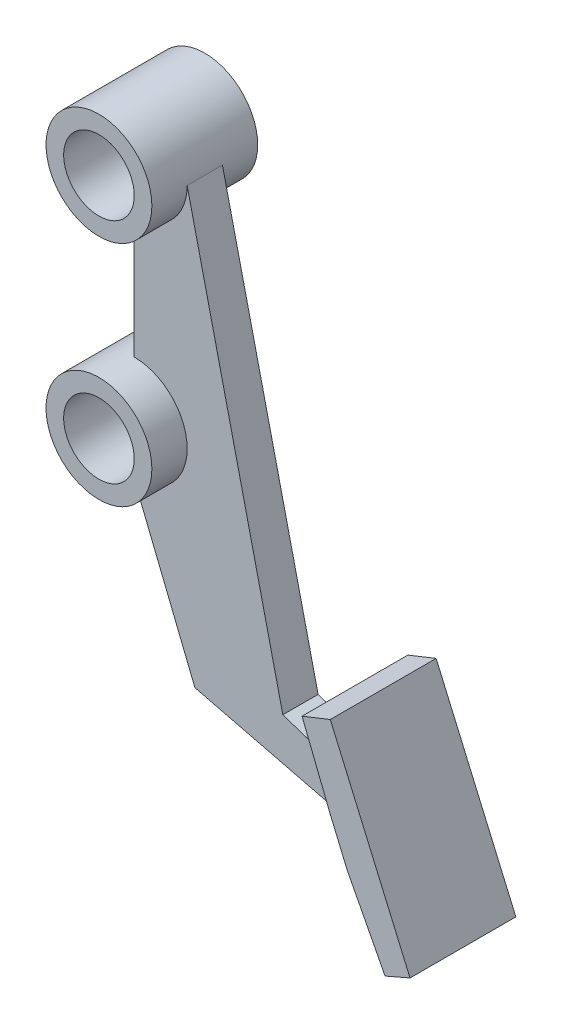
ISO-10303-21;
HEADER;
FILE_DESCRIPTION(('STEP AP214'),'2;1');
FILE_NAME('part.step','',(''),(''),'','','');
FILE_SCHEMA(('AUTOMOTIVE_DESIGN { 1 0 10303 214 1 1 1 1 }'));
ENDSEC;
DATA;
#1=APPLICATION_CONTEXT('core data for automotive mechanical design processes');
#2=APPLICATION_PROTOCOL_DEFINITION('international standard','automotive_design',2000,#1);
#3=PRODUCT_CONTEXT('',#1,'mechanical');
#4=PRODUCT('Part','Part','',(#3));
#5=PRODUCT_RELATED_PRODUCT_CATEGORY('part','',(#4));
#6=PRODUCT_DEFINITION_FORMATION('','',#4);
#7=PRODUCT_DEFINITION_CONTEXT('part definition',#1,'design');
#8=PRODUCT_DEFINITION('design','',#6,#7);
#9=PRODUCT_DEFINITION_SHAPE('','',#8);
#10=(LENGTH_UNIT() NAMED_UNIT(*) SI_UNIT(.MILLI.,.METRE.));
#11=(NAMED_UNIT(*) PLANE_ANGLE_UNIT() SI_UNIT($,.RADIAN.));
#12=(NAMED_UNIT(*) SI_UNIT($,.STERADIAN.) SOLID_ANGLE_UNIT());
#13=UNCERTAINTY_MEASURE_WITH_UNIT(LENGTH_MEASURE(1.E-05),#10,'distance_accuracy_value','');
#14=(GEOMETRIC_REPRESENTATION_CONTEXT(3) GLOBAL_UNCERTAINTY_ASSIGNED_CONTEXT((#13)) GLOBAL_UNIT_ASSIGNED_CONTEXT((#10,
#11,#12)) REPRESENTATION_CONTEXT('',''));
#15=CARTESIAN_POINT('',(0.,0.,0.));
#16=DIRECTION('',(0.,0.,1.));
#17=DIRECTION('',(1.,0.,0.));
#18=AXIS2_PLACEMENT_3D('',#15,#16,#17);
#19=CARTESIAN_POINT('',(0.,0.,5.));
#20=DIRECTION('',(-1.,0.,0.));
#21=DIRECTION('',(0.,0.,1.));
#22=AXIS2_PLACEMENT_3D('',#19,#20,#21);
#23=PLANE('',#22);
#24=DIRECTION('',(0.,1.,0.));
#25=VECTOR('',#24,1.);
#26=CARTESIAN_POINT('',(0.,0.,-5.));
#27=LINE('',#26,#25);
#28=CARTESIAN_POINT('',(0.,15.,-5.));
#29=VERTEX_POINT('',#28);
#30=CARTESIAN_POINT('',(0.,49.6107421590963,-5.));
#31=VERTEX_POINT('',#30);
#32=EDGE_CURVE('E103',#29,#31,#27,.T.);
#33=ORIENTED_EDGE('',*,*,#32,.F.);
#34=DIRECTION('',(0.,0.,-1.));
#35=VECTOR('',#34,1.);
#36=CARTESIAN_POINT('',(0.,15.,5.));
#37=LINE('',#36,#35);
#38=CARTESIAN_POINT('',(0.,15.,5.));
#39=VERTEX_POINT('',#38);
#40=EDGE_CURVE('E50',#39,#29,#37,.T.);
#41=ORIENTED_EDGE('',*,*,#40,.F.);
#42=DIRECTION('',(0.,1.,0.));
#43=VECTOR('',#42,1.);
#44=CARTESIAN_POINT('',(0.,0.,5.));
#45=LINE('',#44,#43);
#46=CARTESIAN_POINT('',(0.,49.6107421590963,5.));
#47=VERTEX_POINT('',#46);
#48=EDGE_CURVE('E109',#39,#47,#45,.T.);
#49=ORIENTED_EDGE('',*,*,#48,.T.);
#50=DIRECTION('',(0.,0.,-1.));
#51=VECTOR('',#50,1.);
#52=CARTESIAN_POINT('',(0.,49.6107421590963,5.));
#53=LINE('',#52,#51);
#54=EDGE_CURVE('E12',#47,#31,#53,.T.);
#55=ORIENTED_EDGE('',*,*,#54,.T.);
#56=EDGE_LOOP('',(#33,#41,#49,#55));
#57=FACE_BOUND('',#56,.T.);
#58=ADVANCED_FACE('F42',(#57),#23,.T.);
#59=CARTESIAN_POINT('',(-5.21039874873487,-2.1053966893587,5.));
#60=DIRECTION('',(-0.927167849264318,-0.374646205493369,0.));
#61=DIRECTION('',(0.374646205493369,-0.927167849264318,0.));
#62=AXIS2_PLACEMENT_3D('',#59,#60,#61);
#63=PLANE('',#62);
#64=DIRECTION('',(-0.374646205493369,0.927167849264318,0.));
#65=VECTOR('',#64,1.);
#66=CARTESIAN_POINT('',(-5.21039874873487,-2.1053966893587,-5.));
#67=LINE('',#66,#65);
#68=CARTESIAN_POINT('',(17.2014048465913,-57.5697345978355,-5.));
#69=VERTEX_POINT('',#68);
#70=CARTESIAN_POINT('',(0.,-15.,-5.));
#71=VERTEX_POINT('',#70);
#72=EDGE_CURVE('E143',#69,#71,#67,.T.);
#73=ORIENTED_EDGE('',*,*,#72,.F.);
#74=DIRECTION('',(0.,0.,-1.));
#75=VECTOR('',#74,1.);
#76=CARTESIAN_POINT('',(17.2014048465913,-57.5697345978355,5.));
#77=LINE('',#76,#75);
#78=CARTESIAN_POINT('',(17.2014048465913,-57.5697345978355,5.));
#79=VERTEX_POINT('',#78);
#80=EDGE_CURVE('E121',#79,#69,#77,.T.);
#81=ORIENTED_EDGE('',*,*,#80,.F.);
#82=DIRECTION('',(-0.374646205493369,0.927167849264318,0.));
#83=VECTOR('',#82,1.);
#84=CARTESIAN_POINT('',(-5.21039874873487,-2.1053966893587,5.));
#85=LINE('',#84,#83);
#86=CARTESIAN_POINT('',(0.,-15.,5.));
#87=VERTEX_POINT('',#86);
#88=EDGE_CURVE('E192',#79,#87,#85,.T.);
#89=ORIENTED_EDGE('',*,*,#88,.T.);
#90=DIRECTION('',(0.,0.,-1.));
#91=VECTOR('',#90,1.);
#92=CARTESIAN_POINT('',(0.,-15.,5.));
#93=LINE('',#92,#91);
#94=EDGE_CURVE('E123',#87,#71,#93,.T.);
#95=ORIENTED_EDGE('',*,*,#94,.T.);
#96=EDGE_LOOP('',(#73,#81,#89,#95));
#97=FACE_BOUND('',#96,.T.);
#98=ADVANCED_FACE('F286',(#97),#63,.T.);
#99=CARTESIAN_POINT('',(-12.4073256588162,-50.2605145229617,5.));
#100=DIRECTION('',(-0.239665674560388,-0.970855480716628,0.));
#101=DIRECTION('',(0.970855480716628,-0.239665674560388,0.));
#102=AXIS2_PLACEMENT_3D('',#99,#100,#101);
#103=PLANE('',#102);
#104=DIRECTION('',(-0.970855480716628,0.239665674560388,0.));
#105=VECTOR('',#104,1.);
#106=CARTESIAN_POINT('',(-12.4073256588162,-50.2605145229617,-5.));
#107=LINE('',#106,#105);
#108=CARTESIAN_POINT('',(70.3210757389239,-70.6828724537803,-5.));
#109=VERTEX_POINT('',#108);
#110=EDGE_CURVE('E145',#109,#69,#107,.T.);
#111=ORIENTED_EDGE('',*,*,#110,.F.);
#112=DIRECTION('',(0.,0.,-1.));
#113=VECTOR('',#112,1.);
#114=CARTESIAN_POINT('',(70.3210757389239,-70.6828724537803,5.));
#115=LINE('',#114,#113);
#116=CARTESIAN_POINT('',(70.3210757389239,-70.6828724537803,5.));
#117=VERTEX_POINT('',#116);
#118=EDGE_CURVE('E119',#117,#109,#115,.T.);
#119=ORIENTED_EDGE('',*,*,#118,.F.);
#120=DIRECTION('',(-0.970855480716628,0.239665674560388,0.));
#121=VECTOR('',#120,1.);
#122=CARTESIAN_POINT('',(-12.4073256588162,-50.2605145229617,5.));
#123=LINE('',#122,#121);
#124=EDGE_CURVE('E187',#117,#79,#123,.T.);
#125=ORIENTED_EDGE('',*,*,#124,.T.);
#126=ORIENTED_EDGE('',*,*,#80,.T.);
#127=EDGE_LOOP('',(#111,#119,#125,#126));
#128=FACE_BOUND('',#127,.T.);
#129=ADVANCED_FACE('F290',(#128),#103,.T.);
#130=CARTESIAN_POINT('',(-11.2720536882183,-34.1292766433985,5.));
#131=DIRECTION('',(0.313613098737151,0.949550853983335,0.));
#132=DIRECTION('',(-0.949550853983335,0.313613098737151,0.));
#133=AXIS2_PLACEMENT_3D('',#130,#131,#132);
#134=PLANE('',#133);
#135=DIRECTION('',(0.949550853983335,-0.313613098737151,0.));
#136=VECTOR('',#135,1.);
#137=CARTESIAN_POINT('',(-11.2720536882183,-34.1292766433985,-5.));
#138=LINE('',#137,#136);
#139=CARTESIAN_POINT('',(42.1191041737359,-51.7630520141547,-5.));
#140=VERTEX_POINT('',#139);
#141=CARTESIAN_POINT('',(65.5792825213485,-59.5113671229842,-5.));
#142=VERTEX_POINT('',#141);
#143=EDGE_CURVE('E107',#140,#142,#138,.T.);
#144=ORIENTED_EDGE('',*,*,#143,.F.);
#145=DIRECTION('',(0.,0.,-1.));
#146=VECTOR('',#145,1.);
#147=CARTESIAN_POINT('',(42.1191041737359,-51.7630520141547,5.));
#148=LINE('',#147,#146);
#149=CARTESIAN_POINT('',(42.1191041737359,-51.7630520141547,5.));
#150=VERTEX_POINT('',#149);
#151=EDGE_CURVE('E58',#150,#140,#148,.T.);
#152=ORIENTED_EDGE('',*,*,#151,.F.);
#153=DIRECTION('',(0.949550853983335,-0.313613098737151,0.));
#154=VECTOR('',#153,1.);
#155=CARTESIAN_POINT('',(-11.2720536882183,-34.1292766433985,5.));
#156=LINE('',#155,#154);
#157=CARTESIAN_POINT('',(65.5792825213485,-59.5113671229842,5.));
#158=VERTEX_POINT('',#157);
#159=EDGE_CURVE('E178',#150,#158,#156,.T.);
#160=ORIENTED_EDGE('',*,*,#159,.T.);
#161=DIRECTION('',(0.,0.,-1.));
#162=VECTOR('',#161,1.);
#163=CARTESIAN_POINT('',(65.5792825213485,-59.5113671229842,5.));
#164=LINE('',#163,#162);
#165=EDGE_CURVE('E116',#158,#142,#164,.T.);
#166=ORIENTED_EDGE('',*,*,#165,.T.);
#167=EDGE_LOOP('',(#144,#152,#160,#166));
#168=FACE_BOUND('',#167,.T.);
#169=ADVANCED_FACE('F177',(#168),#134,.T.);
#170=CARTESIAN_POINT('',(28.5083800829121,6.64343493125239,5.));
#171=DIRECTION('',(0.97390558138489,0.226953560331974,0.));
#172=DIRECTION('',(-0.226953560331974,0.97390558138489,0.));
#173=AXIS2_PLACEMENT_3D('',#170,#171,#172);
#174=PLANE('',#173);
#175=DIRECTION('',(0.226953560331974,-0.97390558138489,0.));
#176=VECTOR('',#175,1.);
#177=CARTESIAN_POINT('',(28.5083800829121,6.64343493125239,-5.));
#178=LINE('',#177,#176);
#179=CARTESIAN_POINT('',(15.,64.6107421590963,-5.));
#180=VERTEX_POINT('',#179);
#181=EDGE_CURVE('E100',#180,#140,#178,.T.);
#182=ORIENTED_EDGE('',*,*,#181,.F.);
#183=DIRECTION('',(0.,0.,-1.));
#184=VECTOR('',#183,1.);
#185=CARTESIAN_POINT('',(15.,64.6107421590963,5.));
#186=LINE('',#185,#184);
#187=CARTESIAN_POINT('',(15.,64.6107421590963,5.));
#188=VERTEX_POINT('',#187);
#189=EDGE_CURVE('E82',#188,#180,#186,.T.);
#190=ORIENTED_EDGE('',*,*,#189,.F.);
#191=DIRECTION('',(0.226953560331974,-0.97390558138489,0.));
#192=VECTOR('',#191,1.);
#193=CARTESIAN_POINT('',(28.5083800829121,6.64343493125239,5.));
#194=LINE('',#193,#192);
#195=EDGE_CURVE('E93',#188,#150,#194,.T.);
#196=ORIENTED_EDGE('',*,*,#195,.T.);
#197=ORIENTED_EDGE('',*,*,#151,.T.);
#198=EDGE_LOOP('',(#182,#190,#196,#197));
#199=FACE_BOUND('',#198,.T.);
#200=ADVANCED_FACE('F106',(#199),#174,.T.);
#201=CARTESIAN_POINT('',(0.,0.,5.));
#202=DIRECTION('',(0.,0.,1.));
#203=DIRECTION('',(1.,0.,0.));
#204=AXIS2_PLACEMENT_3D('',#201,#202,#203);
#205=PLANE('',#204);
#206=CARTESIAN_POINT('',(0.,64.6107421590963,5.));
#207=DIRECTION('',(0.,0.,1.));
#208=DIRECTION('',(1.,0.,0.));
#209=AXIS2_PLACEMENT_3D('',#206,#207,#208);
#210=CIRCLE('',#209,15.);
#211=EDGE_CURVE('E91',#47,#188,#210,.T.);
#212=ORIENTED_EDGE('',*,*,#211,.F.);
#213=ORIENTED_EDGE('',*,*,#48,.F.);
#214=CARTESIAN_POINT('',(0.,0.,5.));
#215=DIRECTION('',(0.,0.,1.));
#216=DIRECTION('',(1.,0.,0.));
#217=AXIS2_PLACEMENT_3D('',#214,#215,#216);
#218=CIRCLE('',#217,15.);
#219=EDGE_CURVE('E135',#87,#39,#218,.T.);
#220=ORIENTED_EDGE('',*,*,#219,.F.);
#221=ORIENTED_EDGE('',*,*,#88,.F.);
#222=ORIENTED_EDGE('',*,*,#124,.F.);
#223=DIRECTION('',(0.390715108289013,-0.92051165345948,0.));
#224=VECTOR('',#223,1.);
#225=CARTESIAN_POINT('',(34.1643330177379,14.5011972683678,5.));
#226=LINE('',#225,#224);
#227=EDGE_CURVE('E183',#158,#117,#226,.T.);
#228=ORIENTED_EDGE('',*,*,#227,.F.);
#229=ORIENTED_EDGE('',*,*,#159,.F.);
#230=ORIENTED_EDGE('',*,*,#195,.F.);
#231=EDGE_LOOP('',(#212,#213,#220,#221,#222,#228,#229,#230));
#232=FACE_BOUND('',#231,.T.);
#233=ADVANCED_FACE('F302',(#232),#205,.T.);
#234=CARTESIAN_POINT('',(0.,0.,-5.));
#235=DIRECTION('',(0.,0.,1.));
#236=DIRECTION('',(1.,0.,0.));
#237=AXIS2_PLACEMENT_3D('',#234,#235,#236);
#238=PLANE('',#237);
#239=CARTESIAN_POINT('',(0.,64.6107421590963,-5.));
#240=DIRECTION('',(0.,0.,1.));
#241=DIRECTION('',(1.,0.,0.));
#242=AXIS2_PLACEMENT_3D('',#239,#240,#241);
#243=CIRCLE('',#242,15.);
#244=EDGE_CURVE('E88',#31,#180,#243,.T.);
#245=ORIENTED_EDGE('',*,*,#244,.T.);
#246=ORIENTED_EDGE('',*,*,#181,.T.);
#247=ORIENTED_EDGE('',*,*,#143,.T.);
#248=DIRECTION('',(0.390715108289013,-0.92051165345948,0.));
#249=VECTOR('',#248,1.);
#250=CARTESIAN_POINT('',(34.1643330177379,14.5011972683678,-5.));
#251=LINE('',#250,#249);
#252=EDGE_CURVE('E111',#142,#109,#251,.T.);
#253=ORIENTED_EDGE('',*,*,#252,.T.);
#254=ORIENTED_EDGE('',*,*,#110,.T.);
#255=ORIENTED_EDGE('',*,*,#72,.T.);
#256=CARTESIAN_POINT('',(0.,0.,-5.));
#257=DIRECTION('',(0.,0.,1.));
#258=DIRECTION('',(1.,0.,0.));
#259=AXIS2_PLACEMENT_3D('',#256,#257,#258);
#260=CIRCLE('',#259,15.);
#261=EDGE_CURVE('E133',#71,#29,#260,.T.);
#262=ORIENTED_EDGE('',*,*,#261,.T.);
#263=ORIENTED_EDGE('',*,*,#32,.T.);
#264=EDGE_LOOP('',(#245,#246,#247,#253,#254,#255,#262,#263));
#265=FACE_BOUND('',#264,.T.);
#266=ADVANCED_FACE('F98',(#265),#238,.F.);
#267=CARTESIAN_POINT('',(0.,0.,15.));
#268=DIRECTION('',(0.,0.,-1.));
#269=DIRECTION('',(-1.,0.,0.));
#270=AXIS2_PLACEMENT_3D('',#267,#268,#269);
#271=CYLINDRICAL_SURFACE('',#270,10.);
#272=CARTESIAN_POINT('',(0.,0.,15.));
#273=DIRECTION('',(0.,0.,1.));
#274=DIRECTION('',(1.,0.,0.));
#275=AXIS2_PLACEMENT_3D('',#272,#273,#274);
#276=CIRCLE('',#275,10.);
#277=CARTESIAN_POINT('',(10.,0.,15.));
#278=VERTEX_POINT('',#277);
#279=EDGE_CURVE('E200',#278,#278,#276,.T.);
#280=ORIENTED_EDGE('',*,*,#279,.T.);
#281=EDGE_LOOP('',(#280));
#282=FACE_BOUND('',#281,.T.);
#283=CARTESIAN_POINT('',(0.,0.,-15.));
#284=DIRECTION('',(0.,0.,1.));
#285=DIRECTION('',(1.,0.,0.));
#286=AXIS2_PLACEMENT_3D('',#283,#284,#285);
#287=CIRCLE('',#286,10.);
#288=CARTESIAN_POINT('',(10.,0.,-15.));
#289=VERTEX_POINT('',#288);
#290=EDGE_CURVE('E201',#289,#289,#287,.T.);
#291=ORIENTED_EDGE('',*,*,#290,.F.);
#292=EDGE_LOOP('',(#291));
#293=FACE_BOUND('',#292,.T.);
#294=ADVANCED_FACE('F305',(#282,#293),#271,.F.);
#295=CARTESIAN_POINT('',(0.,0.,15.));
#296=DIRECTION('',(0.,0.,-1.));
#297=DIRECTION('',(-1.,0.,0.));
#298=AXIS2_PLACEMENT_3D('',#295,#296,#297);
#299=CYLINDRICAL_SURFACE('',#298,15.);
#300=ORIENTED_EDGE('',*,*,#219,.T.);
#301=ORIENTED_EDGE('',*,*,#40,.T.);
#302=ORIENTED_EDGE('',*,*,#261,.F.);
#303=ORIENTED_EDGE('',*,*,#94,.F.);
#304=EDGE_LOOP('',(#300,#301,#302,#303));
#305=FACE_BOUND('',#304,.T.);
#306=CARTESIAN_POINT('',(0.,0.,15.));
#307=DIRECTION('',(0.,0.,1.));
#308=DIRECTION('',(1.,0.,0.));
#309=AXIS2_PLACEMENT_3D('',#306,#307,#308);
#310=CIRCLE('',#309,15.);
#311=CARTESIAN_POINT('',(15.,0.,15.));
#312=VERTEX_POINT('',#311);
#313=EDGE_CURVE('E104',#312,#312,#310,.T.);
#314=ORIENTED_EDGE('',*,*,#313,.F.);
#315=EDGE_LOOP('',(#314));
#316=FACE_BOUND('',#315,.T.);
#317=CARTESIAN_POINT('',(0.,0.,-15.));
#318=DIRECTION('',(0.,0.,1.));
#319=DIRECTION('',(1.,0.,0.));
#320=AXIS2_PLACEMENT_3D('',#317,#318,#319);
#321=CIRCLE('',#320,15.);
#322=CARTESIAN_POINT('',(15.,0.,-15.));
#323=VERTEX_POINT('',#322);
#324=EDGE_CURVE('E197',#323,#323,#321,.T.);
#325=ORIENTED_EDGE('',*,*,#324,.T.);
#326=EDGE_LOOP('',(#325));
#327=FACE_BOUND('',#326,.T.);
#328=ADVANCED_FACE('F129',(#305,#316,#327),#299,.T.);
#329=CARTESIAN_POINT('',(0.,0.,15.));
#330=DIRECTION('',(0.,0.,1.));
#331=DIRECTION('',(1.,0.,0.));
#332=AXIS2_PLACEMENT_3D('',#329,#330,#331);
#333=PLANE('',#332);
#334=ORIENTED_EDGE('',*,*,#279,.F.);
#335=EDGE_LOOP('',(#334));
#336=FACE_BOUND('',#335,.T.);
#337=ORIENTED_EDGE('',*,*,#313,.T.);
#338=EDGE_LOOP('',(#337));
#339=FACE_BOUND('',#338,.T.);
#340=ADVANCED_FACE('F313',(#336,#339),#333,.T.);
#341=CARTESIAN_POINT('',(0.,0.,-15.));
#342=DIRECTION('',(0.,0.,1.));
#343=DIRECTION('',(1.,0.,0.));
#344=AXIS2_PLACEMENT_3D('',#341,#342,#343);
#345=PLANE('',#344);
#346=ORIENTED_EDGE('',*,*,#290,.T.);
#347=EDGE_LOOP('',(#346));
#348=FACE_BOUND('',#347,.T.);
#349=ORIENTED_EDGE('',*,*,#324,.F.);
#350=EDGE_LOOP('',(#349));
#351=FACE_BOUND('',#350,.T.);
#352=ADVANCED_FACE('F314',(#348,#351),#345,.F.);
#353=CARTESIAN_POINT('',(34.1643330177379,14.5011972683678,15.));
#354=DIRECTION('',(0.92051165345948,0.390715108289012,0.));
#355=DIRECTION('',(-0.390715108289012,0.92051165345948,0.));
#356=AXIS2_PLACEMENT_3D('',#353,#354,#355);
#357=PLANE('',#356);
#358=DIRECTION('',(0.,0.,-1.));
#359=VECTOR('',#358,1.);
#360=CARTESIAN_POINT('',(70.3210757389239,-70.6828724537803,15.));
#361=LINE('',#360,#359);
#362=CARTESIAN_POINT('',(70.3210757389239,-70.6828724537803,-15.));
#363=VERTEX_POINT('',#362);
#364=EDGE_CURVE('E162',#109,#363,#361,.T.);
#365=ORIENTED_EDGE('',*,*,#364,.F.);
#366=ORIENTED_EDGE('',*,*,#252,.F.);
#367=DIRECTION('',(0.,0.,-1.));
#368=VECTOR('',#367,1.);
#369=CARTESIAN_POINT('',(65.5792825213485,-59.5113671229842,15.));
#370=LINE('',#369,#368);
#371=CARTESIAN_POINT('',(65.5792825213485,-59.5113671229842,-15.));
#372=VERTEX_POINT('',#371);
#373=EDGE_CURVE('E159',#142,#372,#370,.T.);
#374=ORIENTED_EDGE('',*,*,#373,.T.);
#375=DIRECTION('',(0.390715108289013,-0.92051165345948,0.));
#376=VECTOR('',#375,1.);
#377=CARTESIAN_POINT('',(34.1643330177379,14.5011972683678,-15.));
#378=LINE('',#377,#376);
#379=EDGE_CURVE('E229',#372,#363,#378,.T.);
#380=ORIENTED_EDGE('',*,*,#379,.T.);
#381=EDGE_LOOP('',(#365,#366,#374,#380));
#382=FACE_BOUND('',#381,.T.);
#383=ADVANCED_FACE('F156',(#382),#357,.F.);
#384=CARTESIAN_POINT('',(36.1449022545182,14.3952337775457,15.));
#385=DIRECTION('',(-0.92903160708306,-0.37000036897369,0.));
#386=DIRECTION('',(0.37000036897369,-0.92903160708306,0.));
#387=AXIS2_PLACEMENT_3D('',#384,#385,#386);
#388=PLANE('',#387);
#389=DIRECTION('',(-0.37000036897369,0.92903160708306,0.));
#390=VECTOR('',#389,1.);
#391=CARTESIAN_POINT('',(36.1449022545182,14.3952337775457,-15.));
#392=LINE('',#391,#390);
#393=CARTESIAN_POINT('',(57.5640458944728,-39.3859597206286,-15.));
#394=VERTEX_POINT('',#393);
#395=EDGE_CURVE('E173',#372,#394,#392,.T.);
#396=ORIENTED_EDGE('',*,*,#395,.F.);
#397=ORIENTED_EDGE('',*,*,#373,.F.);
#398=ORIENTED_EDGE('',*,*,#165,.F.);
#399=CARTESIAN_POINT('',(65.5792825213485,-59.5113671229842,15.));
#400=VERTEX_POINT('',#399);
#401=EDGE_CURVE('E174',#400,#158,#370,.T.);
#402=ORIENTED_EDGE('',*,*,#401,.F.);
#403=DIRECTION('',(-0.37000036897369,0.92903160708306,0.));
#404=VECTOR('',#403,1.);
#405=CARTESIAN_POINT('',(36.1449022545182,14.3952337775457,15.));
#406=LINE('',#405,#404);
#407=CARTESIAN_POINT('',(57.5640458944728,-39.3859597206286,15.));
#408=VERTEX_POINT('',#407);
#409=EDGE_CURVE('E208',#400,#408,#406,.T.);
#410=ORIENTED_EDGE('',*,*,#409,.T.);
#411=DIRECTION('',(0.,0.,-1.));
#412=VECTOR('',#411,1.);
#413=CARTESIAN_POINT('',(57.5640458944728,-39.3859597206286,15.));
#414=LINE('',#413,#412);
#415=EDGE_CURVE('E227',#408,#394,#414,.T.);
#416=ORIENTED_EDGE('',*,*,#415,.T.);
#417=EDGE_LOOP('',(#396,#397,#398,#402,#410,#416));
#418=FACE_BOUND('',#417,.T.);
#419=ADVANCED_FACE('F168',(#418),#388,.T.);
#420=ORIENTED_EDGE('',*,*,#227,.T.);
#421=CARTESIAN_POINT('',(70.3210757389239,-70.6828724537803,15.));
#422=VERTEX_POINT('',#421);
#423=EDGE_CURVE('E252',#422,#117,#361,.T.);
#424=ORIENTED_EDGE('',*,*,#423,.F.);
#425=DIRECTION('',(0.390715108289013,-0.92051165345948,0.));
#426=VECTOR('',#425,1.);
#427=CARTESIAN_POINT('',(34.1643330177379,14.5011972683678,15.));
#428=LINE('',#427,#426);
#429=EDGE_CURVE('E212',#400,#422,#428,.T.);
#430=ORIENTED_EDGE('',*,*,#429,.F.);
#431=ORIENTED_EDGE('',*,*,#401,.T.);
#432=EDGE_LOOP('',(#420,#424,#430,#431));
#433=FACE_BOUND('',#432,.T.);
#434=ADVANCED_FACE('F344',(#433),#357,.F.);
#435=CARTESIAN_POINT('',(26.439637092024,13.7424351310141,15.));
#436=DIRECTION('',(-0.887301625510955,-0.461189576384395,0.));
#437=DIRECTION('',(0.461189576384395,-0.887301625510955,0.));
#438=AXIS2_PLACEMENT_3D('',#435,#436,#437);
#439=PLANE('',#438);
#440=DIRECTION('',(-0.461189576384395,0.887301625510955,0.));
#441=VECTOR('',#440,1.);
#442=CARTESIAN_POINT('',(26.439637092024,13.7424351310141,-15.));
#443=LINE('',#442,#441);
#444=CARTESIAN_POINT('',(81.099328916585,-91.4195977711283,-15.));
#445=VERTEX_POINT('',#444);
#446=EDGE_CURVE('E231',#445,#363,#443,.T.);
#447=ORIENTED_EDGE('',*,*,#446,.F.);
#448=DIRECTION('',(0.,0.,-1.));
#449=VECTOR('',#448,1.);
#450=CARTESIAN_POINT('',(81.099328916585,-91.4195977711283,15.));
#451=LINE('',#450,#449);
#452=CARTESIAN_POINT('',(81.099328916585,-91.4195977711283,15.));
#453=VERTEX_POINT('',#452);
#454=EDGE_CURVE('E249',#453,#445,#451,.T.);
#455=ORIENTED_EDGE('',*,*,#454,.F.);
#456=DIRECTION('',(-0.461189576384395,0.887301625510955,0.));
#457=VECTOR('',#456,1.);
#458=CARTESIAN_POINT('',(26.439637092024,13.7424351310141,15.));
#459=LINE('',#458,#457);
#460=EDGE_CURVE('E215',#453,#422,#459,.T.);
#461=ORIENTED_EDGE('',*,*,#460,.T.);
#462=ORIENTED_EDGE('',*,*,#423,.T.);
#463=ORIENTED_EDGE('',*,*,#118,.T.);
#464=ORIENTED_EDGE('',*,*,#364,.T.);
#465=EDGE_LOOP('',(#447,#455,#461,#462,#463,#464));
#466=FACE_BOUND('',#465,.T.);
#467=ADVANCED_FACE('F340',(#466),#439,.T.);
#468=CARTESIAN_POINT('',(46.1679935339804,-106.55464567012,15.));
#469=DIRECTION('',(0.397566212323484,-0.917573488511279,0.));
#470=DIRECTION('',(0.917573488511279,0.397566212323484,0.));
#471=AXIS2_PLACEMENT_3D('',#468,#469,#470);
#472=PLANE('',#471);
#473=DIRECTION('',(-0.917573488511279,-0.397566212323484,0.));
#474=VECTOR('',#473,1.);
#475=CARTESIAN_POINT('',(46.1679935339804,-106.55464567012,-15.));
#476=LINE('',#475,#474);
#477=CARTESIAN_POINT('',(88.1785350719859,-88.3523195501477,-15.));
#478=VERTEX_POINT('',#477);
#479=EDGE_CURVE('E234',#478,#445,#476,.T.);
#480=ORIENTED_EDGE('',*,*,#479,.F.);
#481=DIRECTION('',(0.,0.,-1.));
#482=VECTOR('',#481,1.);
#483=CARTESIAN_POINT('',(88.1785350719859,-88.3523195501477,15.));
#484=LINE('',#483,#482);
#485=CARTESIAN_POINT('',(88.1785350719859,-88.3523195501477,15.));
#486=VERTEX_POINT('',#485);
#487=EDGE_CURVE('E246',#486,#478,#484,.T.);
#488=ORIENTED_EDGE('',*,*,#487,.F.);
#489=DIRECTION('',(-0.917573488511279,-0.397566212323484,0.));
#490=VECTOR('',#489,1.);
#491=CARTESIAN_POINT('',(46.1679935339804,-106.55464567012,15.));
#492=LINE('',#491,#490);
#493=EDGE_CURVE('E218',#486,#453,#492,.T.);
#494=ORIENTED_EDGE('',*,*,#493,.T.);
#495=ORIENTED_EDGE('',*,*,#454,.T.);
#496=EDGE_LOOP('',(#480,#488,#494,#495));
#497=FACE_BOUND('',#496,.T.);
#498=ADVANCED_FACE('F336',(#497),#472,.T.);
#499=CARTESIAN_POINT('',(42.0105415380055,18.2023261199726,15.));
#500=DIRECTION('',(0.917573488511279,0.397566212323484,0.));
#501=DIRECTION('',(-0.397566212323484,0.917573488511279,0.));
#502=AXIS2_PLACEMENT_3D('',#499,#500,#501);
#503=PLANE('',#502);
#504=DIRECTION('',(0.397566212323484,-0.917573488511279,0.));
#505=VECTOR('',#504,1.);
#506=CARTESIAN_POINT('',(42.0105415380055,18.2023261199726,-15.));
#507=LINE('',#506,#505);
#508=CARTESIAN_POINT('',(65.5792825213485,-36.1937749911264,-15.));
#509=VERTEX_POINT('',#508);
#510=EDGE_CURVE('E237',#509,#478,#507,.T.);
#511=ORIENTED_EDGE('',*,*,#510,.F.);
#512=DIRECTION('',(0.,0.,-1.));
#513=VECTOR('',#512,1.);
#514=CARTESIAN_POINT('',(65.5792825213485,-36.1937749911264,15.));
#515=LINE('',#514,#513);
#516=CARTESIAN_POINT('',(65.5792825213485,-36.1937749911264,15.));
#517=VERTEX_POINT('',#516);
#518=EDGE_CURVE('E243',#517,#509,#515,.T.);
#519=ORIENTED_EDGE('',*,*,#518,.F.);
#520=DIRECTION('',(0.397566212323484,-0.917573488511279,0.));
#521=VECTOR('',#520,1.);
#522=CARTESIAN_POINT('',(42.0105415380055,18.2023261199726,15.));
#523=LINE('',#522,#521);
#524=EDGE_CURVE('E221',#517,#486,#523,.T.);
#525=ORIENTED_EDGE('',*,*,#524,.T.);
#526=ORIENTED_EDGE('',*,*,#487,.T.);
#527=EDGE_LOOP('',(#511,#519,#525,#526));
#528=FACE_BOUND('',#527,.T.);
#529=ADVANCED_FACE('F332',(#528),#503,.T.);
#530=CARTESIAN_POINT('',(21.4191436399546,-53.7811934981743,15.));
#531=DIRECTION('',(-0.370000368973689,0.92903160708306,0.));
#532=DIRECTION('',(-0.92903160708306,-0.370000368973689,0.));
#533=AXIS2_PLACEMENT_3D('',#530,#531,#532);
#534=PLANE('',#533);
#535=DIRECTION('',(0.92903160708306,0.370000368973689,0.));
#536=VECTOR('',#535,1.);
#537=CARTESIAN_POINT('',(21.4191436399546,-53.7811934981743,-15.));
#538=LINE('',#537,#536);
#539=EDGE_CURVE('E211',#394,#509,#538,.T.);
#540=ORIENTED_EDGE('',*,*,#539,.F.);
#541=ORIENTED_EDGE('',*,*,#415,.F.);
#542=DIRECTION('',(0.92903160708306,0.370000368973689,0.));
#543=VECTOR('',#542,1.);
#544=CARTESIAN_POINT('',(21.4191436399546,-53.7811934981743,15.));
#545=LINE('',#544,#543);
#546=EDGE_CURVE('E224',#408,#517,#545,.T.);
#547=ORIENTED_EDGE('',*,*,#546,.T.);
#548=ORIENTED_EDGE('',*,*,#518,.T.);
#549=EDGE_LOOP('',(#540,#541,#547,#548));
#550=FACE_BOUND('',#549,.T.);
#551=ADVANCED_FACE('F325',(#550),#534,.T.);
#552=CARTESIAN_POINT('',(0.,0.,15.));
#553=DIRECTION('',(0.,0.,1.));
#554=DIRECTION('',(1.,0.,0.));
#555=AXIS2_PLACEMENT_3D('',#552,#553,#554);
#556=PLANE('',#555);
#557=ORIENTED_EDGE('',*,*,#409,.F.);
#558=ORIENTED_EDGE('',*,*,#429,.T.);
#559=ORIENTED_EDGE('',*,*,#460,.F.);
#560=ORIENTED_EDGE('',*,*,#493,.F.);
#561=ORIENTED_EDGE('',*,*,#524,.F.);
#562=ORIENTED_EDGE('',*,*,#546,.F.);
#563=EDGE_LOOP('',(#557,#558,#559,#560,#561,#562));
#564=FACE_BOUND('',#563,.T.);
#565=ADVANCED_FACE('F321',(#564),#556,.T.);
#566=CARTESIAN_POINT('',(0.,0.,-15.));
#567=DIRECTION('',(0.,0.,1.));
#568=DIRECTION('',(1.,0.,0.));
#569=AXIS2_PLACEMENT_3D('',#566,#567,#568);
#570=PLANE('',#569);
#571=ORIENTED_EDGE('',*,*,#395,.T.);
#572=ORIENTED_EDGE('',*,*,#539,.T.);
#573=ORIENTED_EDGE('',*,*,#510,.T.);
#574=ORIENTED_EDGE('',*,*,#479,.T.);
#575=ORIENTED_EDGE('',*,*,#446,.T.);
#576=ORIENTED_EDGE('',*,*,#379,.F.);
#577=EDGE_LOOP('',(#571,#572,#573,#574,#575,#576));
#578=FACE_BOUND('',#577,.T.);
#579=ADVANCED_FACE('F324',(#578),#570,.F.);
#580=CARTESIAN_POINT('',(0.,64.6107421590963,15.));
#581=DIRECTION('',(0.,0.,1.));
#582=DIRECTION('',(1.,0.,0.));
#583=AXIS2_PLACEMENT_3D('',#580,#581,#582);
#584=PLANE('',#583);
#585=CARTESIAN_POINT('',(0.,64.6107421590963,15.));
#586=DIRECTION('',(0.,0.,1.));
#587=DIRECTION('',(1.,0.,0.));
#588=AXIS2_PLACEMENT_3D('',#585,#586,#587);
#589=CIRCLE('',#588,15.);
#590=CARTESIAN_POINT('',(15.,64.6107421590963,15.));
#591=VERTEX_POINT('',#590);
#592=EDGE_CURVE('E261',#591,#591,#589,.T.);
#593=ORIENTED_EDGE('',*,*,#592,.T.);
#594=EDGE_LOOP('',(#593));
#595=FACE_BOUND('',#594,.T.);
#596=CARTESIAN_POINT('',(0.,64.6107421590963,15.));
#597=DIRECTION('',(0.,0.,1.));
#598=DIRECTION('',(1.,0.,0.));
#599=AXIS2_PLACEMENT_3D('',#596,#597,#598);
#600=CIRCLE('',#599,10.);
#601=CARTESIAN_POINT('',(10.,64.6107421590963,15.));
#602=VERTEX_POINT('',#601);
#603=EDGE_CURVE('E255',#602,#602,#600,.T.);
#604=ORIENTED_EDGE('',*,*,#603,.F.);
#605=EDGE_LOOP('',(#604));
#606=FACE_BOUND('',#605,.T.);
#607=ADVANCED_FACE('F271',(#595,#606),#584,.T.);
#608=CARTESIAN_POINT('',(0.,64.6107421590963,-15.));
#609=DIRECTION('',(0.,0.,1.));
#610=DIRECTION('',(1.,0.,0.));
#611=AXIS2_PLACEMENT_3D('',#608,#609,#610);
#612=PLANE('',#611);
#613=CARTESIAN_POINT('',(0.,64.6107421590963,-15.));
#614=DIRECTION('',(0.,0.,1.));
#615=DIRECTION('',(1.,0.,0.));
#616=AXIS2_PLACEMENT_3D('',#613,#614,#615);
#617=CIRCLE('',#616,15.);
#618=CARTESIAN_POINT('',(15.,64.6107421590963,-15.));
#619=VERTEX_POINT('',#618);
#620=EDGE_CURVE('E258',#619,#619,#617,.T.);
#621=ORIENTED_EDGE('',*,*,#620,.F.);
#622=EDGE_LOOP('',(#621));
#623=FACE_BOUND('',#622,.T.);
#624=CARTESIAN_POINT('',(0.,64.6107421590963,-15.));
#625=DIRECTION('',(0.,0.,1.));
#626=DIRECTION('',(1.,0.,0.));
#627=AXIS2_PLACEMENT_3D('',#624,#625,#626);
#628=CIRCLE('',#627,10.);
#629=CARTESIAN_POINT('',(10.,64.6107421590963,-15.));
#630=VERTEX_POINT('',#629);
#631=EDGE_CURVE('E175',#630,#630,#628,.T.);
#632=ORIENTED_EDGE('',*,*,#631,.T.);
#633=EDGE_LOOP('',(#632));
#634=FACE_BOUND('',#633,.T.);
#635=ADVANCED_FACE('F268',(#623,#634),#612,.F.);
#636=CARTESIAN_POINT('',(0.,64.6107421590963,15.));
#637=DIRECTION('',(0.,0.,-1.));
#638=DIRECTION('',(-1.,0.,0.));
#639=AXIS2_PLACEMENT_3D('',#636,#637,#638);
#640=CYLINDRICAL_SURFACE('',#639,15.);
#641=ORIENTED_EDGE('',*,*,#211,.T.);
#642=ORIENTED_EDGE('',*,*,#189,.T.);
#643=ORIENTED_EDGE('',*,*,#244,.F.);
#644=ORIENTED_EDGE('',*,*,#54,.F.);
#645=EDGE_LOOP('',(#641,#642,#643,#644));
#646=FACE_BOUND('',#645,.T.);
#647=ORIENTED_EDGE('',*,*,#592,.F.);
#648=EDGE_LOOP('',(#647));
#649=FACE_BOUND('',#648,.T.);
#650=ORIENTED_EDGE('',*,*,#620,.T.);
#651=EDGE_LOOP('',(#650));
#652=FACE_BOUND('',#651,.T.);
#653=ADVANCED_FACE('F84',(#646,#649,#652),#640,.T.);
#654=CARTESIAN_POINT('',(0.,64.6107421590963,15.));
#655=DIRECTION('',(0.,0.,-1.));
#656=DIRECTION('',(-1.,0.,0.));
#657=AXIS2_PLACEMENT_3D('',#654,#655,#656);
#658=CYLINDRICAL_SURFACE('',#657,10.);
#659=ORIENTED_EDGE('',*,*,#603,.T.);
#660=EDGE_LOOP('',(#659));
#661=FACE_BOUND('',#660,.T.);
#662=ORIENTED_EDGE('',*,*,#631,.F.);
#663=EDGE_LOOP('',(#662));
#664=FACE_BOUND('',#663,.T.);
#665=ADVANCED_FACE('F275',(#661,#664),#658,.F.);
#666=CLOSED_SHELL('',(#58,#98,#129,#169,#200,#233,#266,#294,#328,#340,#352,#383,#419,#434,#467,
#498,#529,#551,#565,#579,#607,#635,#653,#665));
#667=MANIFOLD_SOLID_BREP('B2',#666);
#668=ADVANCED_BREP_SHAPE_REPRESENTATION('',(#18,#667),#14);
#669=SHAPE_DEFINITION_REPRESENTATION(#9,#668);
ENDSEC;
END-ISO-10303-21;
